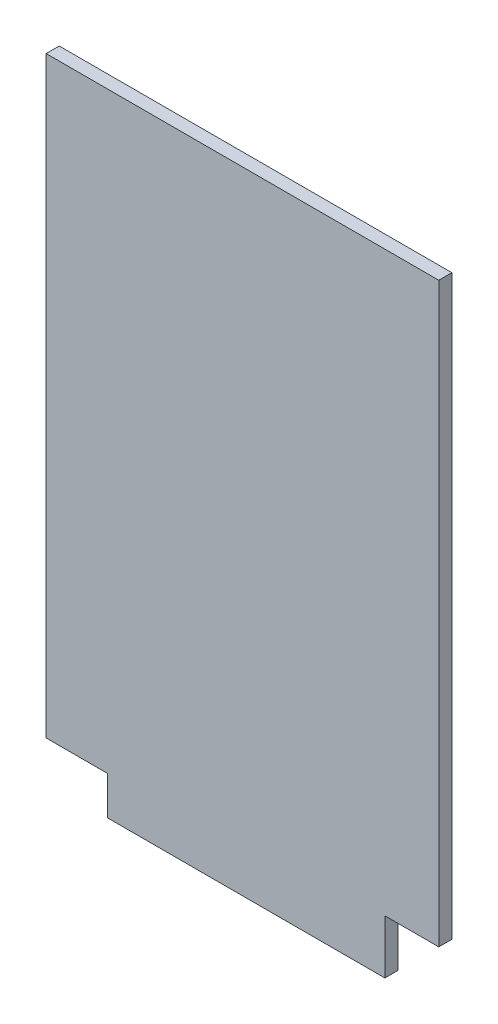
ISO-10303-21;
HEADER;
FILE_DESCRIPTION(('STEP AP214'),'2;1');
FILE_NAME('part.step','',(''),(''),'','','');
FILE_SCHEMA(('AUTOMOTIVE_DESIGN { 1 0 10303 214 1 1 1 1 }'));
ENDSEC;
DATA;
#1=APPLICATION_CONTEXT('core data for automotive mechanical design processes');
#2=APPLICATION_PROTOCOL_DEFINITION('international standard','automotive_design',2000,#1);
#3=PRODUCT_CONTEXT('',#1,'mechanical');
#4=PRODUCT('Part','Part','',(#3));
#5=PRODUCT_RELATED_PRODUCT_CATEGORY('part','',(#4));
#6=PRODUCT_DEFINITION_FORMATION('','',#4);
#7=PRODUCT_DEFINITION_CONTEXT('part definition',#1,'design');
#8=PRODUCT_DEFINITION('design','',#6,#7);
#9=PRODUCT_DEFINITION_SHAPE('','',#8);
#10=(LENGTH_UNIT() NAMED_UNIT(*) SI_UNIT(.MILLI.,.METRE.));
#11=(NAMED_UNIT(*) PLANE_ANGLE_UNIT() SI_UNIT($,.RADIAN.));
#12=(NAMED_UNIT(*) SI_UNIT($,.STERADIAN.) SOLID_ANGLE_UNIT());
#13=UNCERTAINTY_MEASURE_WITH_UNIT(LENGTH_MEASURE(1.E-05),#10,'distance_accuracy_value','');
#14=(GEOMETRIC_REPRESENTATION_CONTEXT(3) GLOBAL_UNCERTAINTY_ASSIGNED_CONTEXT((#13)) GLOBAL_UNIT_ASSIGNED_CONTEXT((#10,
#11,#12)) REPRESENTATION_CONTEXT('',''));
#15=CARTESIAN_POINT('',(0.,0.,0.));
#16=DIRECTION('',(0.,0.,1.));
#17=DIRECTION('',(1.,0.,0.));
#18=AXIS2_PLACEMENT_3D('',#15,#16,#17);
#19=CARTESIAN_POINT('',(51.,7.00000000000001,1.7));
#20=DIRECTION('',(0.,1.,0.));
#21=DIRECTION('',(-1.,0.,0.));
#22=AXIS2_PLACEMENT_3D('',#19,#20,#21);
#23=PLANE('',#22);
#24=DIRECTION('',(1.,0.,0.));
#25=VECTOR('',#24,1.);
#26=CARTESIAN_POINT('',(51.,7.00000000000001,0.));
#27=LINE('',#26,#25);
#28=CARTESIAN_POINT('',(44.,7.00000000000001,0.));
#29=VERTEX_POINT('',#28);
#30=CARTESIAN_POINT('',(51.,7.00000000000001,0.));
#31=VERTEX_POINT('',#30);
#32=EDGE_CURVE('E129',#29,#31,#27,.T.);
#33=ORIENTED_EDGE('',*,*,#32,.T.);
#34=DIRECTION('',(0.,0.,-1.));
#35=VECTOR('',#34,1.);
#36=CARTESIAN_POINT('',(51.,7.00000000000001,1.7));
#37=LINE('',#36,#35);
#38=CARTESIAN_POINT('',(51.,7.00000000000001,1.7));
#39=VERTEX_POINT('',#38);
#40=EDGE_CURVE('E11',#39,#31,#37,.T.);
#41=ORIENTED_EDGE('',*,*,#40,.F.);
#42=DIRECTION('',(1.,0.,0.));
#43=VECTOR('',#42,1.);
#44=CARTESIAN_POINT('',(51.,7.00000000000001,1.7));
#45=LINE('',#44,#43);
#46=CARTESIAN_POINT('',(44.,7.00000000000001,1.7));
#47=VERTEX_POINT('',#46);
#48=EDGE_CURVE('E143',#47,#39,#45,.T.);
#49=ORIENTED_EDGE('',*,*,#48,.F.);
#50=DIRECTION('',(0.,0.,-1.));
#51=VECTOR('',#50,1.);
#52=CARTESIAN_POINT('',(44.,7.00000000000001,1.7));
#53=LINE('',#52,#51);
#54=EDGE_CURVE('E125',#47,#29,#53,.T.);
#55=ORIENTED_EDGE('',*,*,#54,.T.);
#56=EDGE_LOOP('',(#33,#41,#49,#55));
#57=FACE_BOUND('',#56,.T.);
#58=ADVANCED_FACE('F33',(#57),#23,.F.);
#59=CARTESIAN_POINT('',(51.,7.00000000000001,1.7));
#60=DIRECTION('',(-1.,0.,0.));
#61=DIRECTION('',(0.,0.,1.));
#62=AXIS2_PLACEMENT_3D('',#59,#60,#61);
#63=PLANE('',#62);
#64=DIRECTION('',(0.,1.,0.));
#65=VECTOR('',#64,1.);
#66=CARTESIAN_POINT('',(51.,7.00000000000001,0.));
#67=LINE('',#66,#65);
#68=CARTESIAN_POINT('',(51.,82.,0.));
#69=VERTEX_POINT('',#68);
#70=EDGE_CURVE('E132',#31,#69,#67,.T.);
#71=ORIENTED_EDGE('',*,*,#70,.T.);
#72=DIRECTION('',(0.,0.,-1.));
#73=VECTOR('',#72,1.);
#74=CARTESIAN_POINT('',(51.,82.,1.7));
#75=LINE('',#74,#73);
#76=CARTESIAN_POINT('',(51.,82.,1.7));
#77=VERTEX_POINT('',#76);
#78=EDGE_CURVE('E41',#77,#69,#75,.T.);
#79=ORIENTED_EDGE('',*,*,#78,.F.);
#80=DIRECTION('',(0.,1.,0.));
#81=VECTOR('',#80,1.);
#82=CARTESIAN_POINT('',(51.,7.00000000000001,1.7));
#83=LINE('',#82,#81);
#84=EDGE_CURVE('E92',#39,#77,#83,.T.);
#85=ORIENTED_EDGE('',*,*,#84,.F.);
#86=ORIENTED_EDGE('',*,*,#40,.T.);
#87=EDGE_LOOP('',(#71,#79,#85,#86));
#88=FACE_BOUND('',#87,.T.);
#89=ADVANCED_FACE('F178',(#88),#63,.F.);
#90=CARTESIAN_POINT('',(0.,82.,1.7));
#91=DIRECTION('',(0.,-1.,0.));
#92=DIRECTION('',(0.,0.,-1.));
#93=AXIS2_PLACEMENT_3D('',#90,#91,#92);
#94=PLANE('',#93);
#95=DIRECTION('',(-1.,0.,0.));
#96=VECTOR('',#95,1.);
#97=CARTESIAN_POINT('',(0.,82.,0.));
#98=LINE('',#97,#96);
#99=CARTESIAN_POINT('',(0.,82.,0.));
#100=VERTEX_POINT('',#99);
#101=EDGE_CURVE('E134',#69,#100,#98,.T.);
#102=ORIENTED_EDGE('',*,*,#101,.T.);
#103=DIRECTION('',(0.,0.,-1.));
#104=VECTOR('',#103,1.);
#105=CARTESIAN_POINT('',(0.,82.,1.7));
#106=LINE('',#105,#104);
#107=CARTESIAN_POINT('',(0.,82.,1.7));
#108=VERTEX_POINT('',#107);
#109=EDGE_CURVE('E150',#108,#100,#106,.T.);
#110=ORIENTED_EDGE('',*,*,#109,.F.);
#111=DIRECTION('',(-1.,0.,0.));
#112=VECTOR('',#111,1.);
#113=CARTESIAN_POINT('',(0.,82.,1.7));
#114=LINE('',#113,#112);
#115=EDGE_CURVE('E158',#77,#108,#114,.T.);
#116=ORIENTED_EDGE('',*,*,#115,.F.);
#117=ORIENTED_EDGE('',*,*,#78,.T.);
#118=EDGE_LOOP('',(#102,#110,#116,#117));
#119=FACE_BOUND('',#118,.T.);
#120=ADVANCED_FACE('F156',(#119),#94,.F.);
#121=CARTESIAN_POINT('',(0.,5.,1.7));
#122=DIRECTION('',(1.,0.,0.));
#123=DIRECTION('',(0.,0.,-1.));
#124=AXIS2_PLACEMENT_3D('',#121,#122,#123);
#125=PLANE('',#124);
#126=DIRECTION('',(0.,-1.,0.));
#127=VECTOR('',#126,1.);
#128=CARTESIAN_POINT('',(0.,5.,0.));
#129=LINE('',#128,#127);
#130=CARTESIAN_POINT('',(0.,5.,0.));
#131=VERTEX_POINT('',#130);
#132=EDGE_CURVE('E136',#100,#131,#129,.T.);
#133=ORIENTED_EDGE('',*,*,#132,.T.);
#134=DIRECTION('',(0.,0.,-1.));
#135=VECTOR('',#134,1.);
#136=CARTESIAN_POINT('',(0.,5.,1.7));
#137=LINE('',#136,#135);
#138=CARTESIAN_POINT('',(0.,5.,1.7));
#139=VERTEX_POINT('',#138);
#140=EDGE_CURVE('E147',#139,#131,#137,.T.);
#141=ORIENTED_EDGE('',*,*,#140,.F.);
#142=DIRECTION('',(0.,-1.,0.));
#143=VECTOR('',#142,1.);
#144=CARTESIAN_POINT('',(0.,5.,1.7));
#145=LINE('',#144,#143);
#146=EDGE_CURVE('E170',#108,#139,#145,.T.);
#147=ORIENTED_EDGE('',*,*,#146,.F.);
#148=ORIENTED_EDGE('',*,*,#109,.T.);
#149=EDGE_LOOP('',(#133,#141,#147,#148));
#150=FACE_BOUND('',#149,.T.);
#151=ADVANCED_FACE('F166',(#150),#125,.F.);
#152=CARTESIAN_POINT('',(8.,5.,1.7));
#153=DIRECTION('',(0.,1.,0.));
#154=DIRECTION('',(-1.,0.,0.));
#155=AXIS2_PLACEMENT_3D('',#152,#153,#154);
#156=PLANE('',#155);
#157=DIRECTION('',(1.,0.,0.));
#158=VECTOR('',#157,1.);
#159=CARTESIAN_POINT('',(8.,5.,0.));
#160=LINE('',#159,#158);
#161=CARTESIAN_POINT('',(8.,5.,0.));
#162=VERTEX_POINT('',#161);
#163=EDGE_CURVE('E138',#131,#162,#160,.T.);
#164=ORIENTED_EDGE('',*,*,#163,.T.);
#165=DIRECTION('',(0.,0.,-1.));
#166=VECTOR('',#165,1.);
#167=CARTESIAN_POINT('',(8.,5.,1.7));
#168=LINE('',#167,#166);
#169=CARTESIAN_POINT('',(8.,5.,1.7));
#170=VERTEX_POINT('',#169);
#171=EDGE_CURVE('E120',#170,#162,#168,.T.);
#172=ORIENTED_EDGE('',*,*,#171,.F.);
#173=DIRECTION('',(1.,0.,0.));
#174=VECTOR('',#173,1.);
#175=CARTESIAN_POINT('',(8.,5.,1.7));
#176=LINE('',#175,#174);
#177=EDGE_CURVE('E111',#139,#170,#176,.T.);
#178=ORIENTED_EDGE('',*,*,#177,.F.);
#179=ORIENTED_EDGE('',*,*,#140,.T.);
#180=EDGE_LOOP('',(#164,#172,#178,#179));
#181=FACE_BOUND('',#180,.T.);
#182=ADVANCED_FACE('F169',(#181),#156,.F.);
#183=CARTESIAN_POINT('',(8.,0.,1.7));
#184=DIRECTION('',(1.,0.,0.));
#185=DIRECTION('',(0.,0.,-1.));
#186=AXIS2_PLACEMENT_3D('',#183,#184,#185);
#187=PLANE('',#186);
#188=DIRECTION('',(0.,-1.,0.));
#189=VECTOR('',#188,1.);
#190=CARTESIAN_POINT('',(8.,0.,0.));
#191=LINE('',#190,#189);
#192=CARTESIAN_POINT('',(8.,0.,0.));
#193=VERTEX_POINT('',#192);
#194=EDGE_CURVE('E119',#162,#193,#191,.T.);
#195=ORIENTED_EDGE('',*,*,#194,.T.);
#196=DIRECTION('',(0.,0.,-1.));
#197=VECTOR('',#196,1.);
#198=CARTESIAN_POINT('',(8.,0.,1.7));
#199=LINE('',#198,#197);
#200=CARTESIAN_POINT('',(8.,0.,1.7));
#201=VERTEX_POINT('',#200);
#202=EDGE_CURVE('E116',#201,#193,#199,.T.);
#203=ORIENTED_EDGE('',*,*,#202,.F.);
#204=DIRECTION('',(0.,-1.,0.));
#205=VECTOR('',#204,1.);
#206=CARTESIAN_POINT('',(8.,0.,1.7));
#207=LINE('',#206,#205);
#208=EDGE_CURVE('E105',#170,#201,#207,.T.);
#209=ORIENTED_EDGE('',*,*,#208,.F.);
#210=ORIENTED_EDGE('',*,*,#171,.T.);
#211=EDGE_LOOP('',(#195,#203,#209,#210));
#212=FACE_BOUND('',#211,.T.);
#213=ADVANCED_FACE('F117',(#212),#187,.F.);
#214=CARTESIAN_POINT('',(44.,0.,1.7));
#215=DIRECTION('',(0.,1.,0.));
#216=DIRECTION('',(0.,0.,1.));
#217=AXIS2_PLACEMENT_3D('',#214,#215,#216);
#218=PLANE('',#217);
#219=DIRECTION('',(1.,0.,0.));
#220=VECTOR('',#219,1.);
#221=CARTESIAN_POINT('',(44.,0.,0.));
#222=LINE('',#221,#220);
#223=CARTESIAN_POINT('',(44.,0.,0.));
#224=VERTEX_POINT('',#223);
#225=EDGE_CURVE('E78',#193,#224,#222,.T.);
#226=ORIENTED_EDGE('',*,*,#225,.T.);
#227=DIRECTION('',(0.,0.,-1.));
#228=VECTOR('',#227,1.);
#229=CARTESIAN_POINT('',(44.,0.,1.7));
#230=LINE('',#229,#228);
#231=CARTESIAN_POINT('',(44.,0.,1.7));
#232=VERTEX_POINT('',#231);
#233=EDGE_CURVE('E121',#232,#224,#230,.T.);
#234=ORIENTED_EDGE('',*,*,#233,.F.);
#235=DIRECTION('',(1.,0.,0.));
#236=VECTOR('',#235,1.);
#237=CARTESIAN_POINT('',(44.,0.,1.7));
#238=LINE('',#237,#236);
#239=EDGE_CURVE('E109',#201,#232,#238,.T.);
#240=ORIENTED_EDGE('',*,*,#239,.F.);
#241=ORIENTED_EDGE('',*,*,#202,.T.);
#242=EDGE_LOOP('',(#226,#234,#240,#241));
#243=FACE_BOUND('',#242,.T.);
#244=ADVANCED_FACE('F123',(#243),#218,.F.);
#245=CARTESIAN_POINT('',(44.,7.00000000000001,1.7));
#246=DIRECTION('',(-1.,0.,0.));
#247=DIRECTION('',(0.,0.,1.));
#248=AXIS2_PLACEMENT_3D('',#245,#246,#247);
#249=PLANE('',#248);
#250=DIRECTION('',(0.,1.,0.));
#251=VECTOR('',#250,1.);
#252=CARTESIAN_POINT('',(44.,7.00000000000001,0.));
#253=LINE('',#252,#251);
#254=EDGE_CURVE('E84',#224,#29,#253,.T.);
#255=ORIENTED_EDGE('',*,*,#254,.T.);
#256=ORIENTED_EDGE('',*,*,#54,.F.);
#257=DIRECTION('',(0.,1.,0.));
#258=VECTOR('',#257,1.);
#259=CARTESIAN_POINT('',(44.,7.00000000000001,1.7));
#260=LINE('',#259,#258);
#261=EDGE_CURVE('E49',#232,#47,#260,.T.);
#262=ORIENTED_EDGE('',*,*,#261,.F.);
#263=ORIENTED_EDGE('',*,*,#233,.T.);
#264=EDGE_LOOP('',(#255,#256,#262,#263));
#265=FACE_BOUND('',#264,.T.);
#266=ADVANCED_FACE('F194',(#265),#249,.F.);
#267=CARTESIAN_POINT('',(0.,0.,1.7));
#268=DIRECTION('',(0.,0.,1.));
#269=DIRECTION('',(1.,0.,0.));
#270=AXIS2_PLACEMENT_3D('',#267,#268,#269);
#271=PLANE('',#270);
#272=ORIENTED_EDGE('',*,*,#48,.T.);
#273=ORIENTED_EDGE('',*,*,#84,.T.);
#274=ORIENTED_EDGE('',*,*,#115,.T.);
#275=ORIENTED_EDGE('',*,*,#146,.T.);
#276=ORIENTED_EDGE('',*,*,#177,.T.);
#277=ORIENTED_EDGE('',*,*,#208,.T.);
#278=ORIENTED_EDGE('',*,*,#239,.T.);
#279=ORIENTED_EDGE('',*,*,#261,.T.);
#280=EDGE_LOOP('',(#272,#273,#274,#275,#276,#277,#278,#279));
#281=FACE_BOUND('',#280,.T.);
#282=ADVANCED_FACE('F107',(#281),#271,.T.);
#283=CARTESIAN_POINT('',(0.,0.,0.));
#284=DIRECTION('',(0.,0.,1.));
#285=DIRECTION('',(1.,0.,0.));
#286=AXIS2_PLACEMENT_3D('',#283,#284,#285);
#287=PLANE('',#286);
#288=ORIENTED_EDGE('',*,*,#32,.F.);
#289=ORIENTED_EDGE('',*,*,#254,.F.);
#290=ORIENTED_EDGE('',*,*,#225,.F.);
#291=ORIENTED_EDGE('',*,*,#194,.F.);
#292=ORIENTED_EDGE('',*,*,#163,.F.);
#293=ORIENTED_EDGE('',*,*,#132,.F.);
#294=ORIENTED_EDGE('',*,*,#101,.F.);
#295=ORIENTED_EDGE('',*,*,#70,.F.);
#296=EDGE_LOOP('',(#288,#289,#290,#291,#292,#293,#294,#295));
#297=FACE_BOUND('',#296,.T.);
#298=ADVANCED_FACE('F162',(#297),#287,.F.);
#299=CLOSED_SHELL('',(#58,#89,#120,#151,#182,#213,#244,#266,#282,#298));
#300=MANIFOLD_SOLID_BREP('B2',#299);
#301=ADVANCED_BREP_SHAPE_REPRESENTATION('',(#18,#300),#14);
#302=SHAPE_DEFINITION_REPRESENTATION(#9,#301);
ENDSEC;
END-ISO-10303-21;
